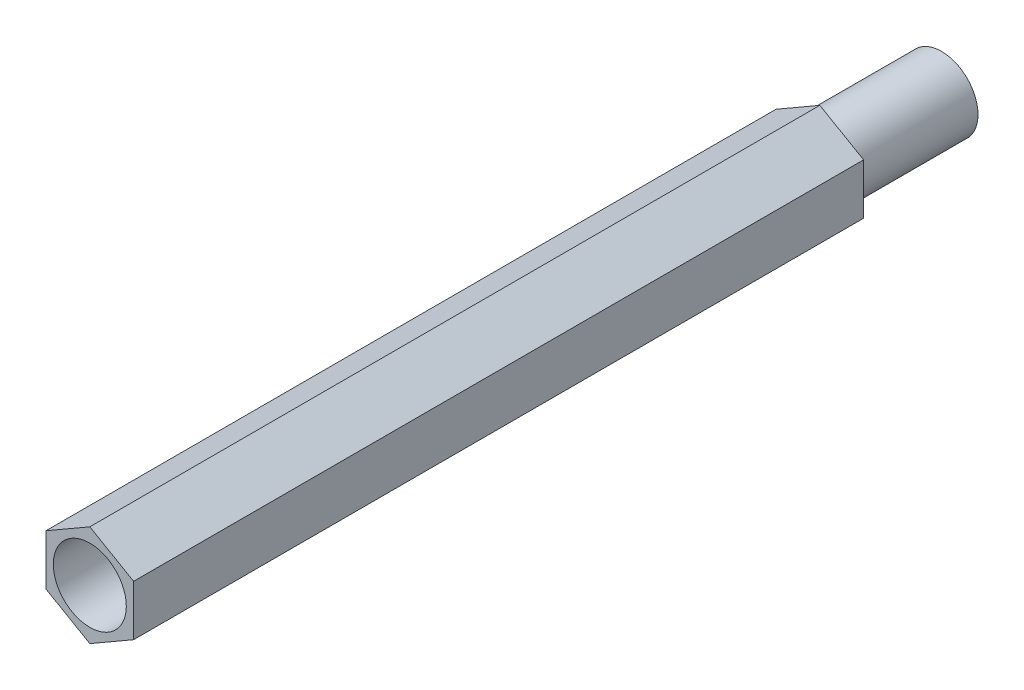
ISO-10303-21;
HEADER;
FILE_DESCRIPTION(('STEP AP214'),'2;1');
FILE_NAME('part.step','',(''),(''),'','','');
FILE_SCHEMA(('AUTOMOTIVE_DESIGN { 1 0 10303 214 1 1 1 1 }'));
ENDSEC;
DATA;
#1=APPLICATION_CONTEXT('core data for automotive mechanical design processes');
#2=APPLICATION_PROTOCOL_DEFINITION('international standard','automotive_design',2000,#1);
#3=PRODUCT_CONTEXT('',#1,'mechanical');
#4=PRODUCT('Part','Part','',(#3));
#5=PRODUCT_RELATED_PRODUCT_CATEGORY('part','',(#4));
#6=PRODUCT_DEFINITION_FORMATION('','',#4);
#7=PRODUCT_DEFINITION_CONTEXT('part definition',#1,'design');
#8=PRODUCT_DEFINITION('design','',#6,#7);
#9=PRODUCT_DEFINITION_SHAPE('','',#8);
#10=(LENGTH_UNIT() NAMED_UNIT(*) SI_UNIT(.MILLI.,.METRE.));
#11=(NAMED_UNIT(*) PLANE_ANGLE_UNIT() SI_UNIT($,.RADIAN.));
#12=(NAMED_UNIT(*) SI_UNIT($,.STERADIAN.) SOLID_ANGLE_UNIT());
#13=UNCERTAINTY_MEASURE_WITH_UNIT(LENGTH_MEASURE(1.E-05),#10,'distance_accuracy_value','');
#14=(GEOMETRIC_REPRESENTATION_CONTEXT(3) GLOBAL_UNCERTAINTY_ASSIGNED_CONTEXT((#13)) GLOBAL_UNIT_ASSIGNED_CONTEXT((#10,
#11,#12)) REPRESENTATION_CONTEXT('',''));
#15=CARTESIAN_POINT('',(0.,0.,0.));
#16=DIRECTION('',(0.,0.,1.));
#17=DIRECTION('',(1.,0.,0.));
#18=AXIS2_PLACEMENT_3D('',#15,#16,#17);
#19=CARTESIAN_POINT('',(0.,0.,30.));
#20=DIRECTION('',(0.,0.,-1.));
#21=DIRECTION('',(-1.,0.,0.));
#22=AXIS2_PLACEMENT_3D('',#19,#20,#21);
#23=CYLINDRICAL_SURFACE('',#22,1.5);
#24=CARTESIAN_POINT('',(0.,0.,30.));
#25=DIRECTION('',(0.,0.,1.));
#26=DIRECTION('',(1.,0.,0.));
#27=AXIS2_PLACEMENT_3D('',#24,#25,#26);
#28=CIRCLE('',#27,1.5);
#29=CARTESIAN_POINT('',(1.5,0.,30.));
#30=VERTEX_POINT('',#29);
#31=EDGE_CURVE('E141',#30,#30,#28,.T.);
#32=ORIENTED_EDGE('',*,*,#31,.T.);
#33=EDGE_LOOP('',(#32));
#34=FACE_BOUND('',#33,.T.);
#35=CARTESIAN_POINT('',(0.,0.,5.));
#36=DIRECTION('',(0.,0.,-1.));
#37=DIRECTION('',(-1.,0.,0.));
#38=AXIS2_PLACEMENT_3D('',#35,#36,#37);
#39=CIRCLE('',#38,1.5);
#40=CARTESIAN_POINT('',(-1.5,0.,5.));
#41=VERTEX_POINT('',#40);
#42=EDGE_CURVE('E258',#41,#41,#39,.T.);
#43=ORIENTED_EDGE('',*,*,#42,.T.);
#44=EDGE_LOOP('',(#43));
#45=FACE_BOUND('',#44,.T.);
#46=ADVANCED_FACE('F45',(#34,#45),#23,.F.);
#47=CARTESIAN_POINT('',(0.,0.,30.));
#48=DIRECTION('',(0.,0.,1.));
#49=DIRECTION('',(1.,0.,0.));
#50=AXIS2_PLACEMENT_3D('',#47,#48,#49);
#51=PLANE('',#50);
#52=DIRECTION('',(-0.866025403784439,0.5,0.));
#53=VECTOR('',#52,1.);
#54=CARTESIAN_POINT('',(1.8,1.03923048454133,30.));
#55=LINE('',#54,#53);
#56=CARTESIAN_POINT('',(1.8,1.03923048454133,30.));
#57=VERTEX_POINT('',#56);
#58=CARTESIAN_POINT('',(0.,2.07846096908265,30.));
#59=VERTEX_POINT('',#58);
#60=EDGE_CURVE('E153',#57,#59,#55,.T.);
#61=ORIENTED_EDGE('',*,*,#60,.T.);
#62=DIRECTION('',(-0.866025403784439,-0.5,0.));
#63=VECTOR('',#62,1.);
#64=CARTESIAN_POINT('',(0.,2.07846096908265,30.));
#65=LINE('',#64,#63);
#66=CARTESIAN_POINT('',(-1.8,1.03923048454133,30.));
#67=VERTEX_POINT('',#66);
#68=EDGE_CURVE('E100',#59,#67,#65,.T.);
#69=ORIENTED_EDGE('',*,*,#68,.T.);
#70=DIRECTION('',(0.,-1.,0.));
#71=VECTOR('',#70,1.);
#72=CARTESIAN_POINT('',(-1.8,1.03923048454133,30.));
#73=LINE('',#72,#71);
#74=CARTESIAN_POINT('',(-1.8,-1.03923048454133,30.));
#75=VERTEX_POINT('',#74);
#76=EDGE_CURVE('E114',#67,#75,#73,.T.);
#77=ORIENTED_EDGE('',*,*,#76,.T.);
#78=DIRECTION('',(0.866025403784439,-0.5,0.));
#79=VECTOR('',#78,1.);
#80=CARTESIAN_POINT('',(-1.8,-1.03923048454133,30.));
#81=LINE('',#80,#79);
#82=CARTESIAN_POINT('',(0.,-2.07846096908265,30.));
#83=VERTEX_POINT('',#82);
#84=EDGE_CURVE('E107',#75,#83,#81,.T.);
#85=ORIENTED_EDGE('',*,*,#84,.T.);
#86=DIRECTION('',(0.866025403784439,0.5,0.));
#87=VECTOR('',#86,1.);
#88=CARTESIAN_POINT('',(0.,-2.07846096908265,30.));
#89=LINE('',#88,#87);
#90=CARTESIAN_POINT('',(1.8,-1.03923048454133,30.));
#91=VERTEX_POINT('',#90);
#92=EDGE_CURVE('E112',#83,#91,#89,.T.);
#93=ORIENTED_EDGE('',*,*,#92,.T.);
#94=DIRECTION('',(0.,1.,0.));
#95=VECTOR('',#94,1.);
#96=CARTESIAN_POINT('',(1.8,-1.03923048454133,30.));
#97=LINE('',#96,#95);
#98=EDGE_CURVE('E63',#91,#57,#97,.T.);
#99=ORIENTED_EDGE('',*,*,#98,.T.);
#100=EDGE_LOOP('',(#61,#69,#77,#85,#93,#99));
#101=FACE_BOUND('',#100,.T.);
#102=ORIENTED_EDGE('',*,*,#31,.F.);
#103=EDGE_LOOP('',(#102));
#104=FACE_BOUND('',#103,.T.);
#105=ADVANCED_FACE('F109',(#101,#104),#51,.T.);
#106=CARTESIAN_POINT('',(0.,0.,0.));
#107=DIRECTION('',(0.,0.,1.));
#108=DIRECTION('',(1.,0.,0.));
#109=AXIS2_PLACEMENT_3D('',#106,#107,#108);
#110=PLANE('',#109);
#111=DIRECTION('',(-0.866025403784439,0.5,0.));
#112=VECTOR('',#111,1.);
#113=CARTESIAN_POINT('',(1.8,1.03923048454133,0.));
#114=LINE('',#113,#112);
#115=CARTESIAN_POINT('',(1.8,1.03923048454133,0.));
#116=VERTEX_POINT('',#115);
#117=CARTESIAN_POINT('',(0.,2.07846096908265,0.));
#118=VERTEX_POINT('',#117);
#119=EDGE_CURVE('E136',#116,#118,#114,.T.);
#120=ORIENTED_EDGE('',*,*,#119,.F.);
#121=DIRECTION('',(0.,1.,0.));
#122=VECTOR('',#121,1.);
#123=CARTESIAN_POINT('',(1.8,-1.03923048454133,0.));
#124=LINE('',#123,#122);
#125=CARTESIAN_POINT('',(1.8,-1.03923048454133,0.));
#126=VERTEX_POINT('',#125);
#127=EDGE_CURVE('E92',#126,#116,#124,.T.);
#128=ORIENTED_EDGE('',*,*,#127,.F.);
#129=DIRECTION('',(0.866025403784439,0.5,0.));
#130=VECTOR('',#129,1.);
#131=CARTESIAN_POINT('',(0.,-2.07846096908265,0.));
#132=LINE('',#131,#130);
#133=CARTESIAN_POINT('',(0.,-2.07846096908265,0.));
#134=VERTEX_POINT('',#133);
#135=EDGE_CURVE('E86',#134,#126,#132,.T.);
#136=ORIENTED_EDGE('',*,*,#135,.F.);
#137=DIRECTION('',(0.866025403784439,-0.5,0.));
#138=VECTOR('',#137,1.);
#139=CARTESIAN_POINT('',(-1.8,-1.03923048454133,0.));
#140=LINE('',#139,#138);
#141=CARTESIAN_POINT('',(-1.8,-1.03923048454133,0.));
#142=VERTEX_POINT('',#141);
#143=EDGE_CURVE('E123',#142,#134,#140,.T.);
#144=ORIENTED_EDGE('',*,*,#143,.F.);
#145=DIRECTION('',(0.,-1.,0.));
#146=VECTOR('',#145,1.);
#147=CARTESIAN_POINT('',(-1.8,1.03923048454133,0.));
#148=LINE('',#147,#146);
#149=CARTESIAN_POINT('',(-1.8,1.03923048454133,0.));
#150=VERTEX_POINT('',#149);
#151=EDGE_CURVE('E144',#150,#142,#148,.T.);
#152=ORIENTED_EDGE('',*,*,#151,.F.);
#153=DIRECTION('',(-0.866025403784439,-0.5,0.));
#154=VECTOR('',#153,1.);
#155=CARTESIAN_POINT('',(0.,2.07846096908265,0.));
#156=LINE('',#155,#154);
#157=EDGE_CURVE('E140',#118,#150,#156,.T.);
#158=ORIENTED_EDGE('',*,*,#157,.F.);
#159=EDGE_LOOP('',(#120,#128,#136,#144,#152,#158));
#160=FACE_BOUND('',#159,.T.);
#161=CARTESIAN_POINT('',(0.,0.,0.));
#162=DIRECTION('',(0.,0.,1.));
#163=DIRECTION('',(1.,0.,0.));
#164=AXIS2_PLACEMENT_3D('',#161,#162,#163);
#165=CIRCLE('',#164,1.5);
#166=CARTESIAN_POINT('',(1.5,0.,0.));
#167=VERTEX_POINT('',#166);
#168=EDGE_CURVE('E257',#167,#167,#165,.F.);
#169=ORIENTED_EDGE('',*,*,#168,.F.);
#170=EDGE_LOOP('',(#169));
#171=FACE_BOUND('',#170,.T.);
#172=ADVANCED_FACE('F166',(#160,#171),#110,.F.);
#173=CARTESIAN_POINT('',(1.8,1.03923048454133,30.));
#174=DIRECTION('',(-0.5,-0.866025403784439,0.));
#175=DIRECTION('',(0.866025403784439,-0.5,0.));
#176=AXIS2_PLACEMENT_3D('',#173,#174,#175);
#177=PLANE('',#176);
#178=ORIENTED_EDGE('',*,*,#119,.T.);
#179=DIRECTION('',(0.,0.,-1.));
#180=VECTOR('',#179,1.);
#181=CARTESIAN_POINT('',(0.,2.07846096908265,30.));
#182=LINE('',#181,#180);
#183=EDGE_CURVE('E11',#59,#118,#182,.T.);
#184=ORIENTED_EDGE('',*,*,#183,.F.);
#185=ORIENTED_EDGE('',*,*,#60,.F.);
#186=DIRECTION('',(0.,0.,-1.));
#187=VECTOR('',#186,1.);
#188=CARTESIAN_POINT('',(1.8,1.03923048454133,30.));
#189=LINE('',#188,#187);
#190=EDGE_CURVE('E132',#57,#116,#189,.T.);
#191=ORIENTED_EDGE('',*,*,#190,.T.);
#192=EDGE_LOOP('',(#178,#184,#185,#191));
#193=FACE_BOUND('',#192,.T.);
#194=ADVANCED_FACE('F47',(#193),#177,.F.);
#195=CARTESIAN_POINT('',(0.,2.07846096908265,30.));
#196=DIRECTION('',(0.5,-0.866025403784439,0.));
#197=DIRECTION('',(0.866025403784439,0.5,0.));
#198=AXIS2_PLACEMENT_3D('',#195,#196,#197);
#199=PLANE('',#198);
#200=ORIENTED_EDGE('',*,*,#157,.T.);
#201=DIRECTION('',(0.,0.,-1.));
#202=VECTOR('',#201,1.);
#203=CARTESIAN_POINT('',(-1.8,1.03923048454133,30.));
#204=LINE('',#203,#202);
#205=EDGE_CURVE('E55',#67,#150,#204,.T.);
#206=ORIENTED_EDGE('',*,*,#205,.F.);
#207=ORIENTED_EDGE('',*,*,#68,.F.);
#208=ORIENTED_EDGE('',*,*,#183,.T.);
#209=EDGE_LOOP('',(#200,#206,#207,#208));
#210=FACE_BOUND('',#209,.T.);
#211=ADVANCED_FACE('F198',(#210),#199,.F.);
#212=CARTESIAN_POINT('',(-1.8,1.03923048454133,30.));
#213=DIRECTION('',(1.,0.,0.));
#214=DIRECTION('',(0.,1.,0.));
#215=AXIS2_PLACEMENT_3D('',#212,#213,#214);
#216=PLANE('',#215);
#217=ORIENTED_EDGE('',*,*,#151,.T.);
#218=DIRECTION('',(0.,0.,-1.));
#219=VECTOR('',#218,1.);
#220=CARTESIAN_POINT('',(-1.8,-1.03923048454133,30.));
#221=LINE('',#220,#219);
#222=EDGE_CURVE('E125',#75,#142,#221,.T.);
#223=ORIENTED_EDGE('',*,*,#222,.F.);
#224=ORIENTED_EDGE('',*,*,#76,.F.);
#225=ORIENTED_EDGE('',*,*,#205,.T.);
#226=EDGE_LOOP('',(#217,#223,#224,#225));
#227=FACE_BOUND('',#226,.T.);
#228=ADVANCED_FACE('F163',(#227),#216,.F.);
#229=CARTESIAN_POINT('',(-1.8,-1.03923048454133,30.));
#230=DIRECTION('',(0.5,0.866025403784439,0.));
#231=DIRECTION('',(-0.866025403784439,0.5,0.));
#232=AXIS2_PLACEMENT_3D('',#229,#230,#231);
#233=PLANE('',#232);
#234=ORIENTED_EDGE('',*,*,#143,.T.);
#235=DIRECTION('',(0.,0.,-1.));
#236=VECTOR('',#235,1.);
#237=CARTESIAN_POINT('',(0.,-2.07846096908265,30.));
#238=LINE('',#237,#236);
#239=EDGE_CURVE('E120',#83,#134,#238,.T.);
#240=ORIENTED_EDGE('',*,*,#239,.F.);
#241=ORIENTED_EDGE('',*,*,#84,.F.);
#242=ORIENTED_EDGE('',*,*,#222,.T.);
#243=EDGE_LOOP('',(#234,#240,#241,#242));
#244=FACE_BOUND('',#243,.T.);
#245=ADVANCED_FACE('F121',(#244),#233,.F.);
#246=CARTESIAN_POINT('',(0.,-2.07846096908265,30.));
#247=DIRECTION('',(-0.5,0.866025403784439,0.));
#248=DIRECTION('',(-0.866025403784439,-0.5,0.));
#249=AXIS2_PLACEMENT_3D('',#246,#247,#248);
#250=PLANE('',#249);
#251=ORIENTED_EDGE('',*,*,#135,.T.);
#252=DIRECTION('',(0.,0.,-1.));
#253=VECTOR('',#252,1.);
#254=CARTESIAN_POINT('',(1.8,-1.03923048454133,30.));
#255=LINE('',#254,#253);
#256=EDGE_CURVE('E126',#91,#126,#255,.T.);
#257=ORIENTED_EDGE('',*,*,#256,.F.);
#258=ORIENTED_EDGE('',*,*,#92,.F.);
#259=ORIENTED_EDGE('',*,*,#239,.T.);
#260=EDGE_LOOP('',(#251,#257,#258,#259));
#261=FACE_BOUND('',#260,.T.);
#262=ADVANCED_FACE('F128',(#261),#250,.F.);
#263=CARTESIAN_POINT('',(1.8,-1.03923048454133,30.));
#264=DIRECTION('',(-1.,0.,0.));
#265=DIRECTION('',(0.,-1.,0.));
#266=AXIS2_PLACEMENT_3D('',#263,#264,#265);
#267=PLANE('',#266);
#268=ORIENTED_EDGE('',*,*,#127,.T.);
#269=ORIENTED_EDGE('',*,*,#190,.F.);
#270=ORIENTED_EDGE('',*,*,#98,.F.);
#271=ORIENTED_EDGE('',*,*,#256,.T.);
#272=EDGE_LOOP('',(#268,#269,#270,#271));
#273=FACE_BOUND('',#272,.T.);
#274=ADVANCED_FACE('F171',(#273),#267,.F.);
#275=CARTESIAN_POINT('',(0.,0.,5.));
#276=DIRECTION('',(0.,0.,-1.));
#277=DIRECTION('',(-1.,0.,0.));
#278=AXIS2_PLACEMENT_3D('',#275,#276,#277);
#279=PLANE('',#278);
#280=ORIENTED_EDGE('',*,*,#42,.F.);
#281=EDGE_LOOP('',(#280));
#282=FACE_BOUND('',#281,.T.);
#283=ADVANCED_FACE('F173',(#282),#279,.F.);
#284=CARTESIAN_POINT('',(0.,0.,-5.));
#285=DIRECTION('',(0.,0.,1.));
#286=DIRECTION('',(1.,0.,0.));
#287=AXIS2_PLACEMENT_3D('',#284,#285,#286);
#288=CYLINDRICAL_SURFACE('',#287,1.5);
#289=CARTESIAN_POINT('',(0.,0.,-5.));
#290=DIRECTION('',(0.,0.,-1.));
#291=DIRECTION('',(-1.,0.,0.));
#292=AXIS2_PLACEMENT_3D('',#289,#290,#291);
#293=CIRCLE('',#292,1.5);
#294=CARTESIAN_POINT('',(-1.5,0.,-5.));
#295=VERTEX_POINT('',#294);
#296=EDGE_CURVE('E255',#295,#295,#293,.T.);
#297=ORIENTED_EDGE('',*,*,#296,.F.);
#298=EDGE_LOOP('',(#297));
#299=FACE_BOUND('',#298,.T.);
#300=ORIENTED_EDGE('',*,*,#168,.T.);
#301=EDGE_LOOP('',(#300));
#302=FACE_BOUND('',#301,.T.);
#303=ADVANCED_FACE('F180',(#299,#302),#288,.T.);
#304=CARTESIAN_POINT('',(0.,0.,-5.));
#305=DIRECTION('',(0.,0.,-1.));
#306=DIRECTION('',(-1.,0.,0.));
#307=AXIS2_PLACEMENT_3D('',#304,#305,#306);
#308=PLANE('',#307);
#309=ORIENTED_EDGE('',*,*,#296,.T.);
#310=EDGE_LOOP('',(#309));
#311=FACE_BOUND('',#310,.T.);
#312=ADVANCED_FACE('F241',(#311),#308,.T.);
#313=CLOSED_SHELL('',(#46,#105,#172,#194,#211,#228,#245,#262,#274,#283,#303,#312));
#314=MANIFOLD_SOLID_BREP('B2',#313);
#315=ADVANCED_BREP_SHAPE_REPRESENTATION('',(#18,#314),#14);
#316=SHAPE_DEFINITION_REPRESENTATION(#9,#315);
ENDSEC;
END-ISO-10303-21;
